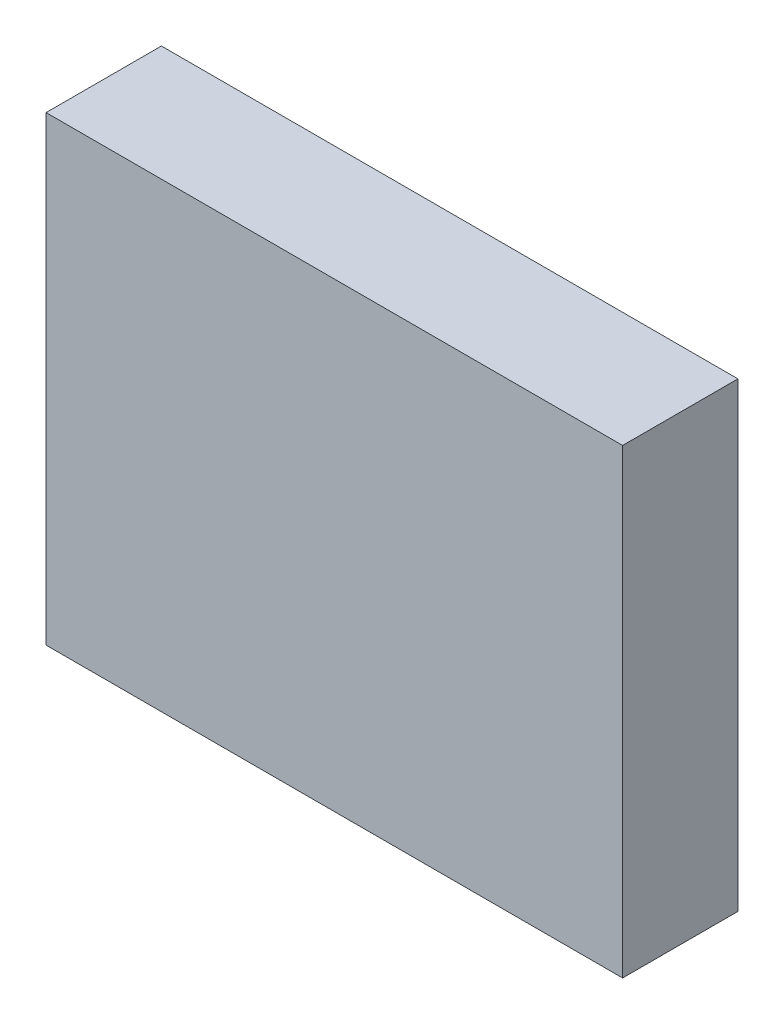
ISO-10303-21;
HEADER;
FILE_DESCRIPTION(('STEP AP214'),'2;1');
FILE_NAME('part.step','',(''),(''),'','','');
FILE_SCHEMA(('AUTOMOTIVE_DESIGN { 1 0 10303 214 1 1 1 1 }'));
ENDSEC;
DATA;
#1=APPLICATION_CONTEXT('core data for automotive mechanical design processes');
#2=APPLICATION_PROTOCOL_DEFINITION('international standard','automotive_design',2000,#1);
#3=PRODUCT_CONTEXT('',#1,'mechanical');
#4=PRODUCT('Part','Part','',(#3));
#5=PRODUCT_RELATED_PRODUCT_CATEGORY('part','',(#4));
#6=PRODUCT_DEFINITION_FORMATION('','',#4);
#7=PRODUCT_DEFINITION_CONTEXT('part definition',#1,'design');
#8=PRODUCT_DEFINITION('design','',#6,#7);
#9=PRODUCT_DEFINITION_SHAPE('','',#8);
#10=(LENGTH_UNIT() NAMED_UNIT(*) SI_UNIT(.MILLI.,.METRE.));
#11=(NAMED_UNIT(*) PLANE_ANGLE_UNIT() SI_UNIT($,.RADIAN.));
#12=(NAMED_UNIT(*) SI_UNIT($,.STERADIAN.) SOLID_ANGLE_UNIT());
#13=UNCERTAINTY_MEASURE_WITH_UNIT(LENGTH_MEASURE(1.E-05),#10,'distance_accuracy_value','');
#14=(GEOMETRIC_REPRESENTATION_CONTEXT(3) GLOBAL_UNCERTAINTY_ASSIGNED_CONTEXT((#13)) GLOBAL_UNIT_ASSIGNED_CONTEXT((#10,
#11,#12)) REPRESENTATION_CONTEXT('',''));
#15=CARTESIAN_POINT('',(0.,0.,0.));
#16=DIRECTION('',(0.,0.,1.));
#17=DIRECTION('',(1.,0.,0.));
#18=AXIS2_PLACEMENT_3D('',#15,#16,#17);
#19=CARTESIAN_POINT('',(-25.,-20.,10.));
#20=DIRECTION('',(1.,0.,0.));
#21=DIRECTION('',(0.,0.,-1.));
#22=AXIS2_PLACEMENT_3D('',#19,#20,#21);
#23=PLANE('',#22);
#24=DIRECTION('',(0.,-1.,0.));
#25=VECTOR('',#24,1.);
#26=CARTESIAN_POINT('',(-25.,-20.,0.));
#27=LINE('',#26,#25);
#28=CARTESIAN_POINT('',(-25.,20.,0.));
#29=VERTEX_POINT('',#28);
#30=CARTESIAN_POINT('',(-25.,-20.,0.));
#31=VERTEX_POINT('',#30);
#32=EDGE_CURVE('E113',#29,#31,#27,.T.);
#33=ORIENTED_EDGE('',*,*,#32,.T.);
#34=DIRECTION('',(0.,0.,-1.));
#35=VECTOR('',#34,1.);
#36=CARTESIAN_POINT('',(-25.,-20.,10.));
#37=LINE('',#36,#35);
#38=CARTESIAN_POINT('',(-25.,-20.,10.));
#39=VERTEX_POINT('',#38);
#40=EDGE_CURVE('E11',#39,#31,#37,.T.);
#41=ORIENTED_EDGE('',*,*,#40,.F.);
#42=DIRECTION('',(0.,-1.,0.));
#43=VECTOR('',#42,1.);
#44=CARTESIAN_POINT('',(-25.,-20.,10.));
#45=LINE('',#44,#43);
#46=CARTESIAN_POINT('',(-25.,20.,10.));
#47=VERTEX_POINT('',#46);
#48=EDGE_CURVE('E97',#47,#39,#45,.T.);
#49=ORIENTED_EDGE('',*,*,#48,.F.);
#50=DIRECTION('',(0.,0.,-1.));
#51=VECTOR('',#50,1.);
#52=CARTESIAN_POINT('',(-25.,20.,10.));
#53=LINE('',#52,#51);
#54=EDGE_CURVE('E109',#47,#29,#53,.T.);
#55=ORIENTED_EDGE('',*,*,#54,.T.);
#56=EDGE_LOOP('',(#33,#41,#49,#55));
#57=FACE_BOUND('',#56,.T.);
#58=ADVANCED_FACE('F45',(#57),#23,.F.);
#59=CARTESIAN_POINT('',(25.,-20.,10.));
#60=DIRECTION('',(0.,1.,0.));
#61=DIRECTION('',(-1.,0.,0.));
#62=AXIS2_PLACEMENT_3D('',#59,#60,#61);
#63=PLANE('',#62);
#64=DIRECTION('',(1.,0.,0.));
#65=VECTOR('',#64,1.);
#66=CARTESIAN_POINT('',(25.,-20.,0.));
#67=LINE('',#66,#65);
#68=CARTESIAN_POINT('',(25.,-20.,0.));
#69=VERTEX_POINT('',#68);
#70=EDGE_CURVE('E102',#31,#69,#67,.T.);
#71=ORIENTED_EDGE('',*,*,#70,.T.);
#72=DIRECTION('',(0.,0.,-1.));
#73=VECTOR('',#72,1.);
#74=CARTESIAN_POINT('',(25.,-20.,10.));
#75=LINE('',#74,#73);
#76=CARTESIAN_POINT('',(25.,-20.,10.));
#77=VERTEX_POINT('',#76);
#78=EDGE_CURVE('E54',#77,#69,#75,.T.);
#79=ORIENTED_EDGE('',*,*,#78,.F.);
#80=DIRECTION('',(1.,0.,0.));
#81=VECTOR('',#80,1.);
#82=CARTESIAN_POINT('',(25.,-20.,10.));
#83=LINE('',#82,#81);
#84=EDGE_CURVE('E92',#39,#77,#83,.T.);
#85=ORIENTED_EDGE('',*,*,#84,.F.);
#86=ORIENTED_EDGE('',*,*,#40,.T.);
#87=EDGE_LOOP('',(#71,#79,#85,#86));
#88=FACE_BOUND('',#87,.T.);
#89=ADVANCED_FACE('F101',(#88),#63,.F.);
#90=CARTESIAN_POINT('',(25.,-20.,10.));
#91=DIRECTION('',(-1.,0.,0.));
#92=DIRECTION('',(0.,-1.,0.));
#93=AXIS2_PLACEMENT_3D('',#90,#91,#92);
#94=PLANE('',#93);
#95=DIRECTION('',(0.,1.,0.));
#96=VECTOR('',#95,1.);
#97=CARTESIAN_POINT('',(25.,-20.,0.));
#98=LINE('',#97,#96);
#99=CARTESIAN_POINT('',(25.,20.,0.));
#100=VERTEX_POINT('',#99);
#101=EDGE_CURVE('E79',#69,#100,#98,.T.);
#102=ORIENTED_EDGE('',*,*,#101,.T.);
#103=DIRECTION('',(0.,0.,-1.));
#104=VECTOR('',#103,1.);
#105=CARTESIAN_POINT('',(25.,20.,10.));
#106=LINE('',#105,#104);
#107=CARTESIAN_POINT('',(25.,20.,10.));
#108=VERTEX_POINT('',#107);
#109=EDGE_CURVE('E104',#108,#100,#106,.T.);
#110=ORIENTED_EDGE('',*,*,#109,.F.);
#111=DIRECTION('',(0.,1.,0.));
#112=VECTOR('',#111,1.);
#113=CARTESIAN_POINT('',(25.,-20.,10.));
#114=LINE('',#113,#112);
#115=EDGE_CURVE('E95',#77,#108,#114,.T.);
#116=ORIENTED_EDGE('',*,*,#115,.F.);
#117=ORIENTED_EDGE('',*,*,#78,.T.);
#118=EDGE_LOOP('',(#102,#110,#116,#117));
#119=FACE_BOUND('',#118,.T.);
#120=ADVANCED_FACE('F105',(#119),#94,.F.);
#121=CARTESIAN_POINT('',(25.,20.,10.));
#122=DIRECTION('',(0.,-1.,0.));
#123=DIRECTION('',(1.,0.,0.));
#124=AXIS2_PLACEMENT_3D('',#121,#122,#123);
#125=PLANE('',#124);
#126=DIRECTION('',(-1.,0.,0.));
#127=VECTOR('',#126,1.);
#128=CARTESIAN_POINT('',(25.,20.,0.));
#129=LINE('',#128,#127);
#130=EDGE_CURVE('E85',#100,#29,#129,.T.);
#131=ORIENTED_EDGE('',*,*,#130,.T.);
#132=ORIENTED_EDGE('',*,*,#54,.F.);
#133=DIRECTION('',(-1.,0.,0.));
#134=VECTOR('',#133,1.);
#135=CARTESIAN_POINT('',(25.,20.,10.));
#136=LINE('',#135,#134);
#137=EDGE_CURVE('E62',#108,#47,#136,.T.);
#138=ORIENTED_EDGE('',*,*,#137,.F.);
#139=ORIENTED_EDGE('',*,*,#109,.T.);
#140=EDGE_LOOP('',(#131,#132,#138,#139));
#141=FACE_BOUND('',#140,.T.);
#142=ADVANCED_FACE('F126',(#141),#125,.F.);
#143=CARTESIAN_POINT('',(0.,0.,10.));
#144=DIRECTION('',(0.,0.,1.));
#145=DIRECTION('',(1.,0.,0.));
#146=AXIS2_PLACEMENT_3D('',#143,#144,#145);
#147=PLANE('',#146);
#148=ORIENTED_EDGE('',*,*,#48,.T.);
#149=ORIENTED_EDGE('',*,*,#84,.T.);
#150=ORIENTED_EDGE('',*,*,#115,.T.);
#151=ORIENTED_EDGE('',*,*,#137,.T.);
#152=EDGE_LOOP('',(#148,#149,#150,#151));
#153=FACE_BOUND('',#152,.T.);
#154=ADVANCED_FACE('F93',(#153),#147,.T.);
#155=CARTESIAN_POINT('',(0.,0.,0.));
#156=DIRECTION('',(0.,0.,1.));
#157=DIRECTION('',(1.,0.,0.));
#158=AXIS2_PLACEMENT_3D('',#155,#156,#157);
#159=PLANE('',#158);
#160=ORIENTED_EDGE('',*,*,#32,.F.);
#161=ORIENTED_EDGE('',*,*,#130,.F.);
#162=ORIENTED_EDGE('',*,*,#101,.F.);
#163=ORIENTED_EDGE('',*,*,#70,.F.);
#164=EDGE_LOOP('',(#160,#161,#162,#163));
#165=FACE_BOUND('',#164,.T.);
#166=ADVANCED_FACE('F129',(#165),#159,.F.);
#167=CLOSED_SHELL('',(#58,#89,#120,#142,#154,#166));
#168=MANIFOLD_SOLID_BREP('B2',#167);
#169=ADVANCED_BREP_SHAPE_REPRESENTATION('',(#18,#168),#14);
#170=SHAPE_DEFINITION_REPRESENTATION(#9,#169);
ENDSEC;
END-ISO-10303-21;
